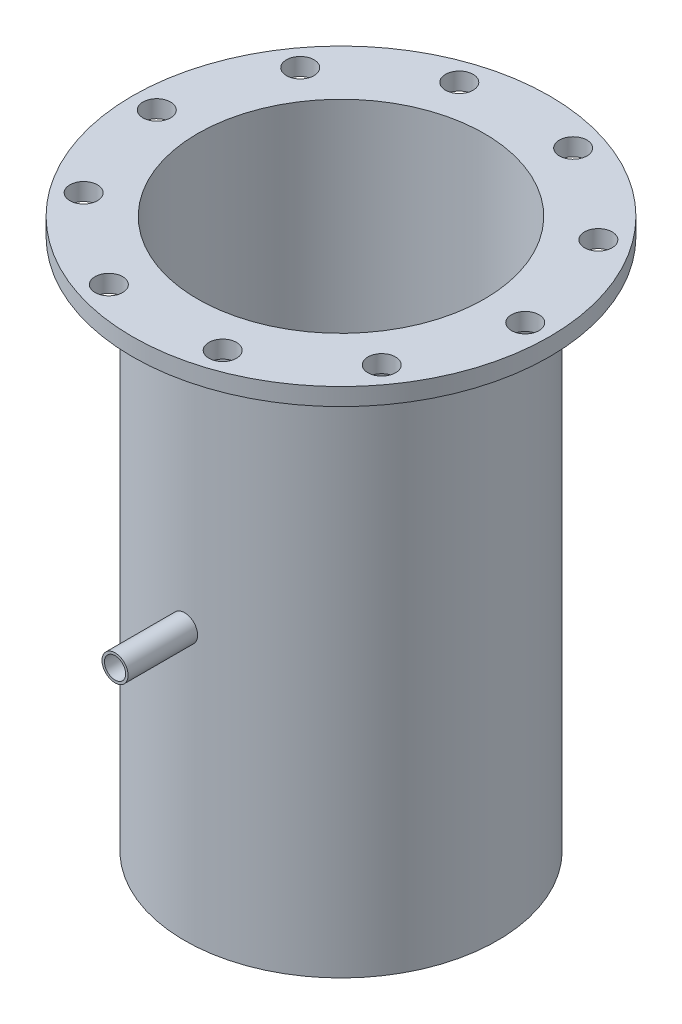
ISO-10303-21;
HEADER;
FILE_DESCRIPTION(('STEP AP214'),'2;1');
FILE_NAME('part.step','',(''),(''),'','','');
FILE_SCHEMA(('AUTOMOTIVE_DESIGN { 1 0 10303 214 1 1 1 1 }'));
ENDSEC;
DATA;
#1=APPLICATION_CONTEXT('core data for automotive mechanical design processes');
#2=APPLICATION_PROTOCOL_DEFINITION('international standard','automotive_design',2000,#1);
#3=PRODUCT_CONTEXT('',#1,'mechanical');
#4=PRODUCT('Part','Part','',(#3));
#5=PRODUCT_RELATED_PRODUCT_CATEGORY('part','',(#4));
#6=PRODUCT_DEFINITION_FORMATION('','',#4);
#7=PRODUCT_DEFINITION_CONTEXT('part definition',#1,'design');
#8=PRODUCT_DEFINITION('design','',#6,#7);
#9=PRODUCT_DEFINITION_SHAPE('','',#8);
#10=(LENGTH_UNIT() NAMED_UNIT(*) SI_UNIT(.MILLI.,.METRE.));
#11=(NAMED_UNIT(*) PLANE_ANGLE_UNIT() SI_UNIT($,.RADIAN.));
#12=(NAMED_UNIT(*) SI_UNIT($,.STERADIAN.) SOLID_ANGLE_UNIT());
#13=UNCERTAINTY_MEASURE_WITH_UNIT(LENGTH_MEASURE(1.E-05),#10,'distance_accuracy_value','');
#14=(GEOMETRIC_REPRESENTATION_CONTEXT(3) GLOBAL_UNCERTAINTY_ASSIGNED_CONTEXT((#13)) GLOBAL_UNIT_ASSIGNED_CONTEXT((#10,
#11,#12)) REPRESENTATION_CONTEXT('',''));
#15=CARTESIAN_POINT('',(0.,0.,0.));
#16=DIRECTION('',(0.,0.,1.));
#17=DIRECTION('',(1.,0.,0.));
#18=AXIS2_PLACEMENT_3D('',#15,#16,#17);
#19=CARTESIAN_POINT('',(0.,-101.6,82.5499999999989));
#20=DIRECTION('',(0.,0.,1.));
#21=DIRECTION('',(1.,0.,0.));
#22=AXIS2_PLACEMENT_3D('',#19,#20,#21);
#23=PLANE('',#22);
#24=CARTESIAN_POINT('',(0.,-101.6,82.5499999999989));
#25=DIRECTION('',(0.,0.,1.));
#26=DIRECTION('',(1.,0.,0.));
#27=AXIS2_PLACEMENT_3D('',#24,#25,#26);
#28=CIRCLE('',#27,4.76249999999999);
#29=CARTESIAN_POINT('',(4.76249999999999,-101.6,82.5499999999989));
#30=VERTEX_POINT('',#29);
#31=EDGE_CURVE('E11',#30,#30,#28,.T.);
#32=ORIENTED_EDGE('',*,*,#31,.T.);
#33=EDGE_LOOP('',(#32));
#34=FACE_BOUND('',#33,.T.);
#35=CARTESIAN_POINT('',(0.,-101.6,82.5499999999989));
#36=DIRECTION('',(0.,0.,1.));
#37=DIRECTION('',(1.,0.,0.));
#38=AXIS2_PLACEMENT_3D('',#35,#36,#37);
#39=CIRCLE('',#38,3.8735);
#40=CARTESIAN_POINT('',(3.8735,-101.6,82.5499999999989));
#41=VERTEX_POINT('',#40);
#42=EDGE_CURVE('E62',#41,#41,#39,.T.);
#43=ORIENTED_EDGE('',*,*,#42,.F.);
#44=EDGE_LOOP('',(#43));
#45=FACE_BOUND('',#44,.T.);
#46=ADVANCED_FACE('F47',(#34,#45),#23,.T.);
#47=CARTESIAN_POINT('',(0.,-101.6,57.1499999999989));
#48=DIRECTION('',(0.,0.,1.));
#49=DIRECTION('',(1.,0.,0.));
#50=AXIS2_PLACEMENT_3D('',#47,#48,#49);
#51=PLANE('',#50);
#52=CARTESIAN_POINT('',(0.,-101.6,57.1499999999989));
#53=DIRECTION('',(0.,0.,1.));
#54=DIRECTION('',(1.,0.,0.));
#55=AXIS2_PLACEMENT_3D('',#52,#53,#54);
#56=CIRCLE('',#55,4.76249999999999);
#57=CARTESIAN_POINT('',(4.76249999999999,-101.6,57.1499999999989));
#58=VERTEX_POINT('',#57);
#59=EDGE_CURVE('E51',#58,#58,#56,.T.);
#60=ORIENTED_EDGE('',*,*,#59,.F.);
#61=EDGE_LOOP('',(#60));
#62=FACE_BOUND('',#61,.T.);
#63=CARTESIAN_POINT('',(0.,-101.6,57.1499999999989));
#64=DIRECTION('',(0.,0.,1.));
#65=DIRECTION('',(1.,0.,0.));
#66=AXIS2_PLACEMENT_3D('',#63,#64,#65);
#67=CIRCLE('',#66,3.8735);
#68=CARTESIAN_POINT('',(3.8735,-101.6,57.1499999999989));
#69=VERTEX_POINT('',#68);
#70=EDGE_CURVE('E64',#69,#69,#67,.T.);
#71=ORIENTED_EDGE('',*,*,#70,.T.);
#72=EDGE_LOOP('',(#71));
#73=FACE_BOUND('',#72,.T.);
#74=ADVANCED_FACE('F74',(#62,#73),#51,.F.);
#75=CARTESIAN_POINT('',(0.,-101.6,82.5499999999989));
#76=DIRECTION('',(0.,0.,-1.));
#77=DIRECTION('',(-1.,0.,0.));
#78=AXIS2_PLACEMENT_3D('',#75,#76,#77);
#79=CYLINDRICAL_SURFACE('',#78,4.76249999999999);
#80=ORIENTED_EDGE('',*,*,#31,.F.);
#81=EDGE_LOOP('',(#80));
#82=FACE_BOUND('',#81,.T.);
#83=ORIENTED_EDGE('',*,*,#59,.T.);
#84=EDGE_LOOP('',(#83));
#85=FACE_BOUND('',#84,.T.);
#86=ADVANCED_FACE('F49',(#82,#85),#79,.T.);
#87=CARTESIAN_POINT('',(0.,-101.6,82.5499999999989));
#88=DIRECTION('',(0.,0.,-1.));
#89=DIRECTION('',(-1.,0.,0.));
#90=AXIS2_PLACEMENT_3D('',#87,#88,#89);
#91=CYLINDRICAL_SURFACE('',#90,3.8735);
#92=ORIENTED_EDGE('',*,*,#42,.T.);
#93=EDGE_LOOP('',(#92));
#94=FACE_BOUND('',#93,.T.);
#95=ORIENTED_EDGE('',*,*,#70,.F.);
#96=EDGE_LOOP('',(#95));
#97=FACE_BOUND('',#96,.T.);
#98=ADVANCED_FACE('F70',(#94,#97),#91,.F.);
#99=CLOSED_SHELL('',(#46,#74,#86,#98));
#100=MANIFOLD_SOLID_BREP('B2',#99);
#101=CARTESIAN_POINT('',(76.2,1.20932865269393E-13,0.));
#102=DIRECTION('',(0.,-1.,0.));
#103=DIRECTION('',(1.,0.,0.));
#104=AXIS2_PLACEMENT_3D('',#101,#102,#103);
#105=PLANE('',#104);
#106=CARTESIAN_POINT('',(-20.799933891378,-2.16733220838477E-13,-64.0156141118267));
#107=DIRECTION('',(0.,1.,0.));
#108=DIRECTION('',(0.,0.,1.));
#109=AXIS2_PLACEMENT_3D('',#106,#107,#108);
#110=CIRCLE('',#109,5.04189999999997);
#111=CARTESIAN_POINT('',(-20.799933891378,-2.16733220838477E-13,-58.9737141118267));
#112=VERTEX_POINT('',#111);
#113=EDGE_CURVE('E159',#112,#112,#110,.T.);
#114=ORIENTED_EDGE('',*,*,#113,.F.);
#115=EDGE_LOOP('',(#114));
#116=FACE_BOUND('',#115,.T.);
#117=CARTESIAN_POINT('',(20.7999338913775,2.16470374895971E-13,-64.0156141118268));
#118=DIRECTION('',(0.,1.,0.));
#119=DIRECTION('',(0.,0.,1.));
#120=AXIS2_PLACEMENT_3D('',#117,#118,#119);
#121=CIRCLE('',#120,5.04189999999997);
#122=CARTESIAN_POINT('',(20.7999338913775,2.16470374895971E-13,-58.9737141118269));
#123=VERTEX_POINT('',#122);
#124=EDGE_CURVE('E155',#123,#123,#121,.T.);
#125=ORIENTED_EDGE('',*,*,#124,.F.);
#126=EDGE_LOOP('',(#125));
#127=FACE_BOUND('',#126,.T.);
#128=CARTESIAN_POINT('',(54.4549338913777,5.66939445869475E-13,-39.5638253318064));
#129=DIRECTION('',(0.,1.,0.));
#130=DIRECTION('',(0.,0.,1.));
#131=AXIS2_PLACEMENT_3D('',#128,#129,#130);
#132=CIRCLE('',#131,5.04189999999997);
#133=CARTESIAN_POINT('',(54.4549338913777,5.66939445869475E-13,-34.5219253318065));
#134=VERTEX_POINT('',#133);
#135=EDGE_CURVE('E151',#134,#134,#132,.T.);
#136=ORIENTED_EDGE('',*,*,#135,.F.);
#137=EDGE_LOOP('',(#136));
#138=FACE_BOUND('',#137,.T.);
#139=CARTESIAN_POINT('',(67.31,7.00806718975755E-13,0.));
#140=DIRECTION('',(0.,1.,0.));
#141=DIRECTION('',(0.,0.,1.));
#142=AXIS2_PLACEMENT_3D('',#139,#140,#141);
#143=CIRCLE('',#142,5.04189999999997);
#144=CARTESIAN_POINT('',(67.31,7.00806718975755E-13,5.04189999999997));
#145=VERTEX_POINT('',#144);
#146=EDGE_CURVE('E150',#145,#145,#143,.T.);
#147=ORIENTED_EDGE('',*,*,#146,.F.);
#148=EDGE_LOOP('',(#147));
#149=FACE_BOUND('',#148,.T.);
#150=CARTESIAN_POINT('',(0.,-5.4845766859262E-13,0.));
#151=DIRECTION('',(0.,1.,0.));
#152=DIRECTION('',(-1.,0.,0.));
#153=AXIS2_PLACEMENT_3D('',#150,#151,#152);
#154=CIRCLE('',#153,52.3875);
#155=CARTESIAN_POINT('',(-52.3875,-1.09399914699477E-12,0.));
#156=VERTEX_POINT('',#155);
#157=EDGE_CURVE('E128',#156,#156,#154,.T.);
#158=ORIENTED_EDGE('',*,*,#157,.F.);
#159=EDGE_LOOP('',(#158));
#160=FACE_BOUND('',#159,.T.);
#161=CARTESIAN_POINT('',(0.,-7.96706356220305E-13,0.));
#162=DIRECTION('',(0.,1.,0.));
#163=DIRECTION('',(-1.,0.,0.));
#164=AXIS2_PLACEMENT_3D('',#161,#162,#163);
#165=CIRCLE('',#164,76.2);
#166=CARTESIAN_POINT('',(-76.2,-1.59022123389616E-12,0.));
#167=VERTEX_POINT('',#166);
#168=EDGE_CURVE('E216',#167,#167,#165,.T.);
#169=ORIENTED_EDGE('',*,*,#168,.T.);
#170=EDGE_LOOP('',(#169));
#171=FACE_BOUND('',#170,.T.);
#172=CARTESIAN_POINT('',(-54.4549338913779,-5.67202291811979E-13,-39.5638253318061));
#173=DIRECTION('',(0.,1.,0.));
#174=DIRECTION('',(0.,0.,1.));
#175=AXIS2_PLACEMENT_3D('',#172,#173,#174);
#176=CIRCLE('',#175,5.04189999999997);
#177=CARTESIAN_POINT('',(-54.4549338913779,-5.67202291811979E-13,-34.5219253318061));
#178=VERTEX_POINT('',#177);
#179=EDGE_CURVE('E160',#178,#178,#176,.T.);
#180=ORIENTED_EDGE('',*,*,#179,.F.);
#181=EDGE_LOOP('',(#180));
#182=FACE_BOUND('',#181,.T.);
#183=CARTESIAN_POINT('',(-67.31,-7.01069564918256E-13,0.));
#184=DIRECTION('',(0.,1.,0.));
#185=DIRECTION('',(0.,0.,1.));
#186=AXIS2_PLACEMENT_3D('',#183,#184,#185);
#187=CIRCLE('',#186,5.04189999999997);
#188=CARTESIAN_POINT('',(-67.31,-7.01069564918256E-13,5.04189999999997));
#189=VERTEX_POINT('',#188);
#190=EDGE_CURVE('E164',#189,#189,#187,.T.);
#191=ORIENTED_EDGE('',*,*,#190,.F.);
#192=EDGE_LOOP('',(#191));
#193=FACE_BOUND('',#192,.T.);
#194=CARTESIAN_POINT('',(-54.4549338913774,-5.67202291811973E-13,39.5638253318068));
#195=DIRECTION('',(0.,1.,0.));
#196=DIRECTION('',(0.,0.,1.));
#197=AXIS2_PLACEMENT_3D('',#194,#195,#196);
#198=CIRCLE('',#197,5.04189999999997);
#199=CARTESIAN_POINT('',(-54.4549338913774,-5.67202291811973E-13,44.6057253318068));
#200=VERTEX_POINT('',#199);
#201=EDGE_CURVE('E168',#200,#200,#198,.T.);
#202=ORIENTED_EDGE('',*,*,#201,.F.);
#203=EDGE_LOOP('',(#202));
#204=FACE_BOUND('',#203,.T.);
#205=CARTESIAN_POINT('',(-20.7999338913771,-2.16733220838468E-13,64.015614111827));
#206=DIRECTION('',(0.,1.,0.));
#207=DIRECTION('',(0.,0.,1.));
#208=AXIS2_PLACEMENT_3D('',#205,#206,#207);
#209=CIRCLE('',#208,5.04189999999997);
#210=CARTESIAN_POINT('',(-20.7999338913771,-2.16733220838468E-13,69.0575141118269));
#211=VERTEX_POINT('',#210);
#212=EDGE_CURVE('E172',#211,#211,#209,.T.);
#213=ORIENTED_EDGE('',*,*,#212,.F.);
#214=EDGE_LOOP('',(#213));
#215=FACE_BOUND('',#214,.T.);
#216=CARTESIAN_POINT('',(20.7999338913784,2.16470374895981E-13,64.0156141118266));
#217=DIRECTION('',(0.,1.,0.));
#218=DIRECTION('',(0.,0.,1.));
#219=AXIS2_PLACEMENT_3D('',#216,#217,#218);
#220=CIRCLE('',#219,5.04189999999997);
#221=CARTESIAN_POINT('',(20.7999338913784,2.16470374895981E-13,69.0575141118265));
#222=VERTEX_POINT('',#221);
#223=EDGE_CURVE('E175',#222,#222,#220,.T.);
#224=ORIENTED_EDGE('',*,*,#223,.F.);
#225=EDGE_LOOP('',(#224));
#226=FACE_BOUND('',#225,.T.);
#227=CARTESIAN_POINT('',(54.4549338913782,5.66939445869481E-13,39.5638253318057));
#228=DIRECTION('',(0.,1.,0.));
#229=DIRECTION('',(0.,0.,1.));
#230=AXIS2_PLACEMENT_3D('',#227,#228,#229);
#231=CIRCLE('',#230,5.04189999999997);
#232=CARTESIAN_POINT('',(54.4549338913782,5.66939445869481E-13,44.6057253318056));
#233=VERTEX_POINT('',#232);
#234=EDGE_CURVE('E178',#233,#233,#231,.T.);
#235=ORIENTED_EDGE('',*,*,#234,.F.);
#236=EDGE_LOOP('',(#235));
#237=FACE_BOUND('',#236,.T.);
#238=ADVANCED_FACE('F116',(#116,#127,#138,#149,#160,#171,#182,#193,#204,#215,#226,#237),#105,.F.);
#239=CARTESIAN_POINT('',(0.,0.,0.));
#240=DIRECTION('',(0.,1.,0.));
#241=DIRECTION('',(-1.,0.,0.));
#242=AXIS2_PLACEMENT_3D('',#239,#240,#241);
#243=CYLINDRICAL_SURFACE('',#242,52.3874999999991);
#244=CARTESIAN_POINT('',(1.58749999999999,-101.6,52.3634414453434));
#245=CARTESIAN_POINT('',(1.58749605334298,-101.510851394726,52.3634417699457));
#246=CARTESIAN_POINT('',(1.57996536949235,-101.421638669327,52.3636715537569));
#247=CARTESIAN_POINT('',(1.55002932361462,-101.245671690355,52.364566081924));
#248=CARTESIAN_POINT('',(1.52760619641222,-101.158920502179,52.3652313457498));
#249=CARTESIAN_POINT('',(1.46852553715922,-100.990451285521,52.3669214042028));
#250=CARTESIAN_POINT('',(1.43187497204651,-100.908730816237,52.3679460228363));
#251=CARTESIAN_POINT('',(1.34538981100749,-100.752625194846,52.3702391119555));
#252=CARTESIAN_POINT('',(1.29555843223709,-100.678238258852,52.3715075229161));
#253=CARTESIAN_POINT('',(1.18409917405513,-100.538853988268,52.3741459580202));
#254=CARTESIAN_POINT('',(1.12246668376462,-100.473860341258,52.3755160217525));
#255=CARTESIAN_POINT('',(0.989162788903489,-100.355138610623,52.3782029861036));
#256=CARTESIAN_POINT('',(0.917490984631366,-100.301410975752,52.379519884603));
#257=CARTESIAN_POINT('',(0.766129167202388,-100.206740554413,52.381952270866));
#258=CARTESIAN_POINT('',(0.68643776283704,-100.165799991269,52.3830677235895));
#259=CARTESIAN_POINT('',(0.52130880816257,-100.097880336038,52.3849711681521));
#260=CARTESIAN_POINT('',(0.43587128112312,-100.070901187416,52.3857591613172));
#261=CARTESIAN_POINT('',(0.261703301046753,-100.03167815935,52.3869186449946));
#262=CARTESIAN_POINT('',(0.17297387471299,-100.019429724747,52.3872902642593));
#263=CARTESIAN_POINT('',(-0.00528244311589997,-100.010001779893,52.38757554135));
#264=CARTESIAN_POINT('',(-0.0948093313930118,-100.012822208863,52.3874892010232));
#265=CARTESIAN_POINT('',(-0.272088371299302,-100.033448082269,52.3868684017544));
#266=CARTESIAN_POINT('',(-0.359841095748341,-100.051248608366,52.3863340898929));
#267=CARTESIAN_POINT('',(-0.531112178997399,-100.101321776004,52.3848777350298));
#268=CARTESIAN_POINT('',(-0.614630528396328,-100.133594449675,52.3839556911674));
#269=CARTESIAN_POINT('',(-0.775077889717085,-100.211701447821,52.3818275374945));
#270=CARTESIAN_POINT('',(-0.852005803938502,-100.257538025855,52.3806213804872));
#271=CARTESIAN_POINT('',(-0.997076546010364,-100.361470020824,52.3780609301778));
#272=CARTESIAN_POINT('',(-1.06521935330345,-100.419565466446,52.376706636529));
#273=CARTESIAN_POINT('',(-1.19081423128111,-100.54639391922,52.3740018931666));
#274=CARTESIAN_POINT('',(-1.24826199211306,-100.615131194431,52.3726514452175));
#275=CARTESIAN_POINT('',(-1.35080285896167,-100.761277047552,52.370107191872));
#276=CARTESIAN_POINT('',(-1.39589596293355,-100.838685626897,52.3689133865014));
#277=CARTESIAN_POINT('',(-1.47244701258908,-100.999979155469,52.3668170667423));
#278=CARTESIAN_POINT('',(-1.5039048183634,-101.083864171138,52.3659145553427));
#279=CARTESIAN_POINT('',(-1.55228952000247,-101.255728270701,52.3645027128852));
#280=CARTESIAN_POINT('',(-1.56921645628012,-101.343707343206,52.3639933807339));
#281=CARTESIAN_POINT('',(-1.58805363474005,-101.521224643402,52.3634255245861));
#282=CARTESIAN_POINT('',(-1.58996984768335,-101.61076223696,52.3633668213449));
#283=CARTESIAN_POINT('',(-1.57874674469409,-101.788887849922,52.3637063745061));
#284=CARTESIAN_POINT('',(-1.56560744657682,-101.87747587045,52.3641046303678));
#285=CARTESIAN_POINT('',(-1.52465124490689,-102.051170971284,52.365313043087));
#286=CARTESIAN_POINT('',(-1.49683705488895,-102.136278691998,52.3661231237929));
#287=CARTESIAN_POINT('',(-1.42732336831548,-102.300616946027,52.3680638011517));
#288=CARTESIAN_POINT('',(-1.38562384322144,-102.379847467261,52.3691943984634));
#289=CARTESIAN_POINT('',(-1.28950780192126,-102.530209748727,52.3716490947768));
#290=CARTESIAN_POINT('',(-1.23508726464016,-102.601338937556,52.3729732549136));
#291=CARTESIAN_POINT('',(-1.11507990501404,-102.733453622549,52.3756655872251));
#292=CARTESIAN_POINT('',(-1.04949305367858,-102.794439092377,52.3770337595141));
#293=CARTESIAN_POINT('',(-0.908989270588625,-102.904555102564,52.3796604035778));
#294=CARTESIAN_POINT('',(-0.834069320192632,-102.95368179222,52.3809188396352));
#295=CARTESIAN_POINT('',(-0.677041457006942,-103.038659379455,52.3831836440945));
#296=CARTESIAN_POINT('',(-0.594933560582706,-103.074510307259,52.3841900130703));
#297=CARTESIAN_POINT('',(-0.425875064900393,-103.131911943588,52.3858370688773));
#298=CARTESIAN_POINT('',(-0.338925313296399,-103.153465146709,52.3864778194971));
#299=CARTESIAN_POINT('',(-0.162639278082235,-103.181667699069,52.3873216628192));
#300=CARTESIAN_POINT('',(-0.0733029966915635,-103.188317062169,52.3875247559286));
#301=CARTESIAN_POINT('',(0.105181658087533,-103.186522894775,52.3874703944013));
#302=CARTESIAN_POINT('',(0.194330092583723,-103.17808543131,52.3872131248953));
#303=CARTESIAN_POINT('',(0.369944465273422,-103.146369596908,52.3862673900868));
#304=CARTESIAN_POINT('',(0.456410398158961,-103.123091196608,52.3855789239311));
#305=CARTESIAN_POINT('',(0.624207615801009,-103.06235511976,52.3838483423651));
#306=CARTESIAN_POINT('',(0.705538815116161,-103.024897207339,52.3828062210719));
#307=CARTESIAN_POINT('',(0.86075645979019,-102.936867466166,52.3804857476095));
#308=CARTESIAN_POINT('',(0.93464317378748,-102.886296110855,52.3792074039693));
#309=CARTESIAN_POINT('',(1.07290241213022,-102.77345707217,52.3765580016925));
#310=CARTESIAN_POINT('',(1.1372721181388,-102.711185936408,52.375186915766));
#311=CARTESIAN_POINT('',(1.25466134648337,-102.576702782052,52.3725065161489));
#312=CARTESIAN_POINT('',(1.30767805458305,-102.504488305926,52.3711972178371));
#313=CARTESIAN_POINT('',(1.40086553675492,-102.352139782043,52.3687875855987));
#314=CARTESIAN_POINT('',(1.44102791298361,-102.27200060157,52.3676873884695));
#315=CARTESIAN_POINT('',(1.5072811800323,-102.106175329262,52.3658225237447));
#316=CARTESIAN_POINT('',(1.53338884893491,-102.020495988644,52.3650574562857));
#317=CARTESIAN_POINT('',(1.56387364214342,-101.878562941283,52.3641536118903));
#318=CARTESIAN_POINT('',(1.57272237629605,-101.823230472512,52.3638877098981));
#319=CARTESIAN_POINT('',(1.58453679353414,-101.711940430943,52.3635315247305));
#320=CARTESIAN_POINT('',(1.58750247839143,-101.655982858334,52.3634412415022));
#321=CARTESIAN_POINT('',(1.58749999999999,-101.6,52.3634414453434));
#322=B_SPLINE_CURVE_WITH_KNOTS('',3,(#244,#245,#246,#247,#248,#249,#250,#251,#252,#253,#254,
#255,#256,#257,#258,#259,#260,#261,#262,#263,#264,#265,#266,#267,#268,#269,#270,#271,#272,#273,
#274,#275,#276,#277,#278,#279,#280,#281,#282,#283,#284,#285,#286,#287,#288,#289,#290,#291,#292,
#293,#294,#295,#296,#297,#298,#299,#300,#301,#302,#303,#304,#305,#306,#307,#308,#309,#310,#311,
#312,#313,#314,#315,#316,#317,#318,#319,#320,#321),.UNSPECIFIED.,.T.,.F.,(4,2,2,2,2,2,2,2,2,2,2,
2,2,2,2,2,2,2,2,2,2,2,2,2,2,2,2,2,2,2,2,2,2,2,2,2,2,2,4),(0.,0.26724147085534,0.534802307659918,
0.802232289347037,1.06959705720717,1.33706650261993,1.60454659998991,1.87207317900069,
2.13959867469298,2.40704142253985,2.67448309165799,2.94183698724582,3.20919147638232,
3.47659040975562,3.74398996883748,4.01149705151728,4.27900417847161,4.54651405020324,
4.81402317794075,5.0814258941362,5.34882829391245,5.61618126562285,5.88353478682684,
6.15097293225497,6.41841177202756,6.68593733629001,6.95346229146817,7.22094055792727,
7.4884185756374,7.75578905370639,8.02316006079795,8.29053551573941,8.55790131883006,
8.82534614088055,9.09285718190709,9.360542635097,9.62790782089107,9.79572812344937,
9.96354837546444),.UNSPECIFIED.);
#323=CARTESIAN_POINT('',(1.58749999999999,-101.6,52.3634414453434));
#324=VERTEX_POINT('',#323);
#325=EDGE_CURVE('E184',#324,#324,#322,.T.);
#326=ORIENTED_EDGE('',*,*,#325,.T.);
#327=EDGE_LOOP('',(#326));
#328=FACE_BOUND('',#327,.T.);
#329=CARTESIAN_POINT('',(1.77869966591641E-12,-170.805763516126,0.));
#330=DIRECTION('',(0.,1.,0.));
#331=DIRECTION('',(-1.,0.,0.));
#332=AXIS2_PLACEMENT_3D('',#329,#330,#331);
#333=CIRCLE('',#332,52.3874999999982);
#334=CARTESIAN_POINT('',(-52.3874999999965,-170.805763516127,0.));
#335=VERTEX_POINT('',#334);
#336=EDGE_CURVE('E135',#335,#335,#333,.T.);
#337=ORIENTED_EDGE('',*,*,#336,.F.);
#338=EDGE_LOOP('',(#337));
#339=FACE_BOUND('',#338,.T.);
#340=ORIENTED_EDGE('',*,*,#157,.T.);
#341=EDGE_LOOP('',(#340));
#342=FACE_BOUND('',#341,.T.);
#343=ADVANCED_FACE('F283',(#328,#339,#342),#243,.F.);
#344=CARTESIAN_POINT('',(54.9275,-170.805763516126,0.));
#345=DIRECTION('',(0.,1.,0.));
#346=DIRECTION('',(-1.,0.,0.));
#347=AXIS2_PLACEMENT_3D('',#344,#345,#346);
#348=PLANE('',#347);
#349=CARTESIAN_POINT('',(1.77869966591641E-12,-170.805763516126,0.));
#350=DIRECTION('',(0.,1.,0.));
#351=DIRECTION('',(-1.,0.,0.));
#352=AXIS2_PLACEMENT_3D('',#349,#350,#351);
#353=CIRCLE('',#352,54.9274999999982);
#354=CARTESIAN_POINT('',(-54.9274999999965,-170.805763516127,0.));
#355=VERTEX_POINT('',#354);
#356=EDGE_CURVE('E142',#355,#355,#353,.T.);
#357=ORIENTED_EDGE('',*,*,#356,.F.);
#358=EDGE_LOOP('',(#357));
#359=FACE_BOUND('',#358,.T.);
#360=ORIENTED_EDGE('',*,*,#336,.T.);
#361=EDGE_LOOP('',(#360));
#362=FACE_BOUND('',#361,.T.);
#363=ADVANCED_FACE('F280',(#359,#362),#348,.F.);
#364=CARTESIAN_POINT('',(0.,0.,0.));
#365=DIRECTION('',(0.,1.,0.));
#366=DIRECTION('',(-1.,0.,0.));
#367=AXIS2_PLACEMENT_3D('',#364,#365,#366);
#368=CYLINDRICAL_SURFACE('',#367,54.9274999999982);
#369=CARTESIAN_POINT('',(1.82869110320998E-12,-175.606363516126,0.));
#370=DIRECTION('',(0.,1.,0.));
#371=DIRECTION('',(-1.,0.,0.));
#372=AXIS2_PLACEMENT_3D('',#369,#370,#371);
#373=CIRCLE('',#372,54.9274999999982);
#374=CARTESIAN_POINT('',(-54.9274999999964,-175.606363516127,0.));
#375=VERTEX_POINT('',#374);
#376=EDGE_CURVE('E271',#375,#375,#373,.T.);
#377=ORIENTED_EDGE('',*,*,#376,.F.);
#378=EDGE_LOOP('',(#377));
#379=FACE_BOUND('',#378,.T.);
#380=ORIENTED_EDGE('',*,*,#356,.T.);
#381=EDGE_LOOP('',(#380));
#382=FACE_BOUND('',#381,.T.);
#383=ADVANCED_FACE('F278',(#379,#382),#368,.F.);
#384=CARTESIAN_POINT('',(52.3875,-175.606363516126,0.));
#385=DIRECTION('',(0.,-1.,0.));
#386=DIRECTION('',(1.,0.,0.));
#387=AXIS2_PLACEMENT_3D('',#384,#385,#386);
#388=PLANE('',#387);
#389=CARTESIAN_POINT('',(1.82869110320998E-12,-175.606363516126,0.));
#390=DIRECTION('',(0.,1.,0.));
#391=DIRECTION('',(-1.,0.,0.));
#392=AXIS2_PLACEMENT_3D('',#389,#390,#391);
#393=CIRCLE('',#392,52.3874999999982);
#394=CARTESIAN_POINT('',(-52.3874999999964,-175.606363516127,0.));
#395=VERTEX_POINT('',#394);
#396=EDGE_CURVE('E267',#395,#395,#393,.T.);
#397=ORIENTED_EDGE('',*,*,#396,.F.);
#398=EDGE_LOOP('',(#397));
#399=FACE_BOUND('',#398,.T.);
#400=ORIENTED_EDGE('',*,*,#376,.T.);
#401=EDGE_LOOP('',(#400));
#402=FACE_BOUND('',#401,.T.);
#403=ADVANCED_FACE('F297',(#399,#402),#388,.F.);
#404=CARTESIAN_POINT('',(0.,0.,0.));
#405=DIRECTION('',(0.,1.,0.));
#406=DIRECTION('',(-1.,0.,0.));
#407=AXIS2_PLACEMENT_3D('',#404,#405,#406);
#408=CYLINDRICAL_SURFACE('',#407,52.3874999999982);
#409=CARTESIAN_POINT('',(1.86836684709378E-12,-179.416363516126,0.));
#410=DIRECTION('',(0.,1.,0.));
#411=DIRECTION('',(-1.,0.,0.));
#412=AXIS2_PLACEMENT_3D('',#409,#410,#411);
#413=CIRCLE('',#412,52.3874999999981);
#414=CARTESIAN_POINT('',(-52.3874999999963,-179.416363516127,0.));
#415=VERTEX_POINT('',#414);
#416=EDGE_CURVE('E263',#415,#415,#413,.T.);
#417=ORIENTED_EDGE('',*,*,#416,.F.);
#418=EDGE_LOOP('',(#417));
#419=FACE_BOUND('',#418,.T.);
#420=ORIENTED_EDGE('',*,*,#396,.T.);
#421=EDGE_LOOP('',(#420));
#422=FACE_BOUND('',#421,.T.);
#423=ADVANCED_FACE('F301',(#419,#422),#408,.F.);
#424=CARTESIAN_POINT('',(54.9275,-179.416363516126,0.));
#425=DIRECTION('',(0.,1.,0.));
#426=DIRECTION('',(-1.,0.,0.));
#427=AXIS2_PLACEMENT_3D('',#424,#425,#426);
#428=PLANE('',#427);
#429=CARTESIAN_POINT('',(1.86836684709378E-12,-179.416363516126,0.));
#430=DIRECTION('',(0.,1.,0.));
#431=DIRECTION('',(-1.,0.,0.));
#432=AXIS2_PLACEMENT_3D('',#429,#430,#431);
#433=CIRCLE('',#432,54.9274999999982);
#434=CARTESIAN_POINT('',(-54.9274999999963,-179.416363516127,0.));
#435=VERTEX_POINT('',#434);
#436=EDGE_CURVE('E259',#435,#435,#433,.T.);
#437=ORIENTED_EDGE('',*,*,#436,.F.);
#438=EDGE_LOOP('',(#437));
#439=FACE_BOUND('',#438,.T.);
#440=ORIENTED_EDGE('',*,*,#416,.T.);
#441=EDGE_LOOP('',(#440));
#442=FACE_BOUND('',#441,.T.);
#443=ADVANCED_FACE('F305',(#439,#442),#428,.F.);
#444=CARTESIAN_POINT('',(0.,0.,0.));
#445=DIRECTION('',(0.,1.,0.));
#446=DIRECTION('',(-1.,0.,0.));
#447=AXIS2_PLACEMENT_3D('',#444,#445,#446);
#448=CYLINDRICAL_SURFACE('',#447,54.9274999999981);
#449=CARTESIAN_POINT('',(1.91835828438736E-12,-184.216963516126,0.));
#450=DIRECTION('',(0.,1.,0.));
#451=DIRECTION('',(-1.,0.,0.));
#452=AXIS2_PLACEMENT_3D('',#449,#450,#451);
#453=CIRCLE('',#452,54.9274999999981);
#454=CARTESIAN_POINT('',(-54.9274999999962,-184.216963516127,0.));
#455=VERTEX_POINT('',#454);
#456=EDGE_CURVE('E255',#455,#455,#453,.T.);
#457=ORIENTED_EDGE('',*,*,#456,.F.);
#458=EDGE_LOOP('',(#457));
#459=FACE_BOUND('',#458,.T.);
#460=ORIENTED_EDGE('',*,*,#436,.T.);
#461=EDGE_LOOP('',(#460));
#462=FACE_BOUND('',#461,.T.);
#463=ADVANCED_FACE('F309',(#459,#462),#448,.F.);
#464=CARTESIAN_POINT('',(52.3875,-184.216963516126,0.));
#465=DIRECTION('',(0.,-1.,0.));
#466=DIRECTION('',(1.,0.,0.));
#467=AXIS2_PLACEMENT_3D('',#464,#465,#466);
#468=PLANE('',#467);
#469=CARTESIAN_POINT('',(1.91835828438736E-12,-184.216963516126,0.));
#470=DIRECTION('',(0.,1.,0.));
#471=DIRECTION('',(-1.,0.,0.));
#472=AXIS2_PLACEMENT_3D('',#469,#470,#471);
#473=CIRCLE('',#472,52.3874999999981);
#474=CARTESIAN_POINT('',(-52.3874999999962,-184.216963516127,0.));
#475=VERTEX_POINT('',#474);
#476=EDGE_CURVE('E251',#475,#475,#473,.T.);
#477=ORIENTED_EDGE('',*,*,#476,.F.);
#478=EDGE_LOOP('',(#477));
#479=FACE_BOUND('',#478,.T.);
#480=ORIENTED_EDGE('',*,*,#456,.T.);
#481=EDGE_LOOP('',(#480));
#482=FACE_BOUND('',#481,.T.);
#483=ADVANCED_FACE('F313',(#479,#482),#468,.F.);
#484=CARTESIAN_POINT('',(0.,0.,0.));
#485=DIRECTION('',(0.,1.,0.));
#486=DIRECTION('',(-1.,0.,0.));
#487=AXIS2_PLACEMENT_3D('',#484,#485,#486);
#488=CYLINDRICAL_SURFACE('',#487,52.3874999999981);
#489=CARTESIAN_POINT('',(1.95803402827115E-12,-188.026963516126,0.));
#490=DIRECTION('',(0.,1.,0.));
#491=DIRECTION('',(-1.,0.,0.));
#492=AXIS2_PLACEMENT_3D('',#489,#490,#491);
#493=CIRCLE('',#492,52.3874999999981);
#494=CARTESIAN_POINT('',(-52.3874999999961,-188.026963516127,0.));
#495=VERTEX_POINT('',#494);
#496=EDGE_CURVE('E247',#495,#495,#493,.T.);
#497=ORIENTED_EDGE('',*,*,#496,.F.);
#498=EDGE_LOOP('',(#497));
#499=FACE_BOUND('',#498,.T.);
#500=ORIENTED_EDGE('',*,*,#476,.T.);
#501=EDGE_LOOP('',(#500));
#502=FACE_BOUND('',#501,.T.);
#503=ADVANCED_FACE('F317',(#499,#502),#488,.F.);
#504=CARTESIAN_POINT('',(52.3875,-188.026963516126,0.));
#505=DIRECTION('',(0.,1.,0.));
#506=DIRECTION('',(-1.,0.,0.));
#507=AXIS2_PLACEMENT_3D('',#504,#505,#506);
#508=PLANE('',#507);
#509=CARTESIAN_POINT('',(1.95803402827115E-12,-188.026963516126,0.));
#510=DIRECTION('',(0.,1.,0.));
#511=DIRECTION('',(-1.,0.,0.));
#512=AXIS2_PLACEMENT_3D('',#509,#510,#511);
#513=CIRCLE('',#512,53.8479999999981);
#514=CARTESIAN_POINT('',(-53.8479999999961,-188.026963516127,0.));
#515=VERTEX_POINT('',#514);
#516=EDGE_CURVE('E243',#515,#515,#513,.T.);
#517=ORIENTED_EDGE('',*,*,#516,.F.);
#518=EDGE_LOOP('',(#517));
#519=FACE_BOUND('',#518,.T.);
#520=ORIENTED_EDGE('',*,*,#496,.T.);
#521=EDGE_LOOP('',(#520));
#522=FACE_BOUND('',#521,.T.);
#523=ADVANCED_FACE('F321',(#519,#522),#508,.F.);
#524=CARTESIAN_POINT('',(0.,0.,0.));
#525=DIRECTION('',(0.,1.,0.));
#526=DIRECTION('',(-1.,0.,0.));
#527=AXIS2_PLACEMENT_3D('',#524,#525,#526);
#528=CYLINDRICAL_SURFACE('',#527,53.8479999999981);
#529=CARTESIAN_POINT('',(1.98977462337818E-12,-191.074963516126,0.));
#530=DIRECTION('',(0.,1.,0.));
#531=DIRECTION('',(-1.,0.,0.));
#532=AXIS2_PLACEMENT_3D('',#529,#530,#531);
#533=CIRCLE('',#532,53.847999999998);
#534=CARTESIAN_POINT('',(-53.847999999996,-191.074963516127,0.));
#535=VERTEX_POINT('',#534);
#536=EDGE_CURVE('E239',#535,#535,#533,.T.);
#537=ORIENTED_EDGE('',*,*,#536,.F.);
#538=EDGE_LOOP('',(#537));
#539=FACE_BOUND('',#538,.T.);
#540=ORIENTED_EDGE('',*,*,#516,.T.);
#541=EDGE_LOOP('',(#540));
#542=FACE_BOUND('',#541,.T.);
#543=ADVANCED_FACE('F325',(#539,#542),#528,.F.);
#544=CARTESIAN_POINT('',(53.848,-191.074963516126,0.));
#545=DIRECTION('',(0.,-1.,0.));
#546=DIRECTION('',(1.,0.,0.));
#547=AXIS2_PLACEMENT_3D('',#544,#545,#546);
#548=PLANE('',#547);
#549=CARTESIAN_POINT('',(1.98977462337818E-12,-191.074963516126,0.));
#550=DIRECTION('',(0.,1.,0.));
#551=DIRECTION('',(-1.,0.,0.));
#552=AXIS2_PLACEMENT_3D('',#549,#550,#551);
#553=CIRCLE('',#552,52.387499999998);
#554=CARTESIAN_POINT('',(-52.387499999996,-191.074963516127,0.));
#555=VERTEX_POINT('',#554);
#556=EDGE_CURVE('E235',#555,#555,#553,.T.);
#557=ORIENTED_EDGE('',*,*,#556,.F.);
#558=EDGE_LOOP('',(#557));
#559=FACE_BOUND('',#558,.T.);
#560=ORIENTED_EDGE('',*,*,#536,.T.);
#561=EDGE_LOOP('',(#560));
#562=FACE_BOUND('',#561,.T.);
#563=ADVANCED_FACE('F329',(#559,#562),#548,.F.);
#564=CARTESIAN_POINT('',(0.,0.,0.));
#565=DIRECTION('',(0.,1.,0.));
#566=DIRECTION('',(-1.,0.,0.));
#567=AXIS2_PLACEMENT_3D('',#564,#565,#566);
#568=CYLINDRICAL_SURFACE('',#567,52.387499999998);
#569=CARTESIAN_POINT('',(2.08896398308766E-12,-200.599963516126,0.));
#570=DIRECTION('',(0.,1.,0.));
#571=DIRECTION('',(-1.,0.,0.));
#572=AXIS2_PLACEMENT_3D('',#569,#570,#571);
#573=CIRCLE('',#572,52.3874999999979);
#574=CARTESIAN_POINT('',(-52.3874999999958,-200.599963516127,0.));
#575=VERTEX_POINT('',#574);
#576=EDGE_CURVE('E232',#575,#575,#573,.T.);
#577=ORIENTED_EDGE('',*,*,#576,.F.);
#578=EDGE_LOOP('',(#577));
#579=FACE_BOUND('',#578,.T.);
#580=ORIENTED_EDGE('',*,*,#556,.T.);
#581=EDGE_LOOP('',(#580));
#582=FACE_BOUND('',#581,.T.);
#583=ADVANCED_FACE('F333',(#579,#582),#568,.F.);
#584=CARTESIAN_POINT('',(52.3875,-200.599963516126,0.));
#585=DIRECTION('',(0.,1.,0.));
#586=DIRECTION('',(-1.,0.,0.));
#587=AXIS2_PLACEMENT_3D('',#584,#585,#586);
#588=PLANE('',#587);
#589=CARTESIAN_POINT('',(2.08896398308766E-12,-200.599963516126,0.));
#590=DIRECTION('',(0.,1.,0.));
#591=DIRECTION('',(-1.,0.,0.));
#592=AXIS2_PLACEMENT_3D('',#589,#590,#591);
#593=CIRCLE('',#592,57.1499999999979);
#594=CARTESIAN_POINT('',(-57.1499999999958,-200.599963516127,0.));
#595=VERTEX_POINT('',#594);
#596=EDGE_CURVE('E229',#595,#595,#593,.T.);
#597=ORIENTED_EDGE('',*,*,#596,.F.);
#598=EDGE_LOOP('',(#597));
#599=FACE_BOUND('',#598,.T.);
#600=ORIENTED_EDGE('',*,*,#576,.T.);
#601=EDGE_LOOP('',(#600));
#602=FACE_BOUND('',#601,.T.);
#603=ADVANCED_FACE('F337',(#599,#602),#588,.F.);
#604=CARTESIAN_POINT('',(0.,0.,0.));
#605=DIRECTION('',(0.,1.,0.));
#606=DIRECTION('',(-1.,0.,0.));
#607=AXIS2_PLACEMENT_3D('',#604,#605,#606);
#608=CYLINDRICAL_SURFACE('',#607,57.1499999999989);
#609=CARTESIAN_POINT('',(1.58749999999999,-101.6,57.1279471340419));
#610=CARTESIAN_POINT('',(1.58749605211175,-101.689152114199,57.1279474316997));
#611=CARTESIAN_POINT('',(1.57996477777724,-101.778368434292,57.128158067754));
#612=CARTESIAN_POINT('',(1.55002624968093,-101.954342744377,57.1289780604651));
#613=CARTESIAN_POINT('',(1.52760120702016,-102.04109766515,57.1295878939049));
#614=CARTESIAN_POINT('',(1.4685151605687,-102.209574366095,57.131137146312));
#615=CARTESIAN_POINT('',(1.43186109764306,-102.291298577746,57.1320764045656));
#616=CARTESIAN_POINT('',(1.3453673794669,-102.44741094187,57.1341784653257));
#617=CARTESIAN_POINT('',(1.29553095151814,-102.521800883805,57.1353412130985));
#618=CARTESIAN_POINT('',(1.1840628799189,-102.661186617856,57.1377597968267));
#619=CARTESIAN_POINT('',(1.12242716473918,-102.726179153621,57.1390156648227));
#620=CARTESIAN_POINT('',(0.989117012605628,-102.844897856336,57.1414786515467));
#621=CARTESIAN_POINT('',(0.917442176863669,-102.898623575518,57.1426857683356));
#622=CARTESIAN_POINT('',(0.766077323839181,-102.993287844067,57.144915318081));
#623=CARTESIAN_POINT('',(0.686386161691531,-103.034224563514,57.1459377245994));
#624=CARTESIAN_POINT('',(0.521258984462645,-103.102136824492,57.1476823650718));
#625=CARTESIAN_POINT('',(0.435822990773939,-103.129112418008,57.1484046001434));
#626=CARTESIAN_POINT('',(0.261654822905389,-103.168330026972,57.1494673166232));
#627=CARTESIAN_POINT('',(0.172923510266412,-103.180575865855,57.1498078970967));
#628=CARTESIAN_POINT('',(-0.00533600963123361,-103.189998124708,57.1500692438223));
#629=CARTESIAN_POINT('',(-0.0948642139582852,-103.187174600092,57.1499900116181));
#630=CARTESIAN_POINT('',(-0.27215022771742,-103.166541525401,57.1494207497609));
#631=CARTESIAN_POINT('',(-0.359908518480575,-103.148736107521,57.1489308333799));
#632=CARTESIAN_POINT('',(-0.531189911767372,-103.098651066372,57.1475955512312));
#633=CARTESIAN_POINT('',(-0.614713005671812,-103.066371413647,57.1467501847401));
#634=CARTESIAN_POINT('',(-0.775166350965623,-102.988249467337,57.14479908893));
#635=CARTESIAN_POINT('',(-0.852095679673378,-102.942405279616,57.1436933232535));
#636=CARTESIAN_POINT('',(-0.997167613843303,-102.838457031948,57.1413460531883));
#637=CARTESIAN_POINT('',(-1.06531020259512,-102.780352948684,57.1401045485416));
#638=CARTESIAN_POINT('',(-1.19089843189182,-102.653510878535,57.1376252267919));
#639=CARTESIAN_POINT('',(-1.24834045010227,-102.584769305032,57.1363874110769));
#640=CARTESIAN_POINT('',(-1.35086907445976,-102.438616240437,57.1340554420731));
#641=CARTESIAN_POINT('',(-1.39595567864476,-102.361204747968,57.1329612888072));
#642=CARTESIAN_POINT('',(-1.47249321927563,-102.199907268003,57.1310400454698));
#643=CARTESIAN_POINT('',(-1.50394403992341,-102.116021225531,57.1302129576662));
#644=CARTESIAN_POINT('',(-1.55231490904442,-101.944156800725,57.1289191992328));
#645=CARTESIAN_POINT('',(-1.56923499156878,-101.856178427982,57.1284525277583));
#646=CARTESIAN_POINT('',(-1.58805964098903,-101.67865825475,57.1279323730488));
#647=CARTESIAN_POINT('',(-1.58996922508664,-101.589116986684,57.1278787517535));
#648=CARTESIAN_POINT('',(-1.57873174422918,-101.41098512174,57.1281903832332));
#649=CARTESIAN_POINT('',(-1.5655846941333,-101.322394523924,57.1285556355948));
#650=CARTESIAN_POINT('',(-1.52461129875891,-101.148692775065,57.1296637130646));
#651=CARTESIAN_POINT('',(-1.49678723207342,-101.063581086133,57.1304064795635));
#652=CARTESIAN_POINT('',(-1.42725194456905,-100.899236674478,57.1321858020018));
#653=CARTESIAN_POINT('',(-1.38554070004316,-100.820003961792,57.1332223584428));
#654=CARTESIAN_POINT('',(-1.28940216088666,-100.669643533218,57.1354727451845));
#655=CARTESIAN_POINT('',(-1.23497148675063,-100.598517978857,57.1366866225665));
#656=CARTESIAN_POINT('',(-1.11494414380161,-100.466412577475,57.1391546411726));
#657=CARTESIAN_POINT('',(-1.04934744991446,-100.405432753238,57.1404087824872));
#658=CARTESIAN_POINT('',(-0.908828645119023,-100.295333087782,57.1428163486561));
#659=CARTESIAN_POINT('',(-0.833903998447752,-100.246216482243,57.1439697459781));
#660=CARTESIAN_POINT('',(-0.676869101337222,-100.161259634069,57.1460454112666));
#661=CARTESIAN_POINT('',(-0.5947588658622,-100.125419363787,57.1469676797143));
#662=CARTESIAN_POINT('',(-0.425695814193871,-100.06803822904,57.1484769899983));
#663=CARTESIAN_POINT('',(-0.33874371084156,-100.046495265665,57.1490640810384));
#664=CARTESIAN_POINT('',(-0.162455049027922,-100.018313384018,57.1498370501752));
#665=CARTESIAN_POINT('',(-0.0731184917432114,-100.011674458392,57.1500229284699));
#666=CARTESIAN_POINT('',(0.105370719299731,-100.01348935769,57.1499725211979));
#667=CARTESIAN_POINT('',(0.194523425027754,-100.021938079999,57.149736378358));
#668=CARTESIAN_POINT('',(0.370144519721277,-100.053677962774,57.148868819221));
#669=CARTESIAN_POINT('',(0.456612903358319,-100.076969152702,57.1482374021394));
#670=CARTESIAN_POINT('',(0.624412990162669,-100.137732199333,57.1466504232453));
#671=CARTESIAN_POINT('',(0.705744605357144,-100.175204298825,57.1456948558832));
#672=CARTESIAN_POINT('',(0.860960459673797,-100.263263474453,57.1435672610911));
#673=CARTESIAN_POINT('',(0.934844971278735,-100.3138500705,57.1423952415853));
#674=CARTESIAN_POINT('',(1.07309220000807,-100.426716393747,57.1399664259979));
#675=CARTESIAN_POINT('',(1.13745270695402,-100.488998827545,57.1387096103363));
#676=CARTESIAN_POINT('',(1.25482151619644,-100.623502899139,57.136252756959));
#677=CARTESIAN_POINT('',(1.30782700205327,-100.695726995533,57.135052733387));
#678=CARTESIAN_POINT('',(1.40098890785335,-100.848090232612,57.1328444047671));
#679=CARTESIAN_POINT('',(1.44113729057244,-100.928234283417,57.1318362198003));
#680=CARTESIAN_POINT('',(1.50736211798318,-101.094066149741,57.130127492003));
#681=CARTESIAN_POINT('',(1.53345535585072,-101.179747211838,57.1294265822255));
#682=CARTESIAN_POINT('',(1.56390862135458,-101.321641831665,57.1285989448849));
#683=CARTESIAN_POINT('',(1.57274426965151,-101.376934234637,57.1283555764706));
#684=CARTESIAN_POINT('',(1.58454119684748,-101.488142665183,57.1280295776819));
#685=CARTESIAN_POINT('',(1.58750247722705,-101.544058692598,57.127946947267));
#686=CARTESIAN_POINT('',(1.58749999999999,-101.6,57.1279471340419));
#687=B_SPLINE_CURVE_WITH_KNOTS('',3,(#609,#610,#611,#612,#613,#614,#615,#616,#617,#618,#619,
#620,#621,#622,#623,#624,#625,#626,#627,#628,#629,#630,#631,#632,#633,#634,#635,#636,#637,#638,
#639,#640,#641,#642,#643,#644,#645,#646,#647,#648,#649,#650,#651,#652,#653,#654,#655,#656,#657,
#658,#659,#660,#661,#662,#663,#664,#665,#666,#667,#668,#669,#670,#671,#672,#673,#674,#675,#676,
#677,#678,#679,#680,#681,#682,#683,#684,#685,#686),.UNSPECIFIED.,.T.,.F.,(4,2,2,2,2,2,2,2,2,2,2,
2,2,2,2,2,2,2,2,2,2,2,2,2,2,2,2,2,2,2,2,2,2,2,2,2,2,2,4),(0.,0.267252150547049,
0.534824078570929,0.8022656496446,1.06964180627425,1.33711039209143,1.60458960568858,
1.87210707416104,2.13962354651045,2.40707056400026,2.67451659800839,2.94188889119597,
3.20926172850067,3.47667191906254,3.7440826181693,4.01158367672888,4.27908477776766,
4.54658815044061,4.81409089624818,5.08150422648203,5.34891729280937,5.61628885572309,
5.88366087507336,6.15110401511549,6.41854775572924,6.68606435915281,6.95358040547704,
7.22105717051551,7.48853380356903,7.75591999364439,8.02330671445528,8.29069801331815,
8.55807952502192,8.82552298936276,9.09303271236364,9.36070933591313,9.62806542430726,
9.7957612620326,9.96345705749304),.UNSPECIFIED.);
#688=CARTESIAN_POINT('',(1.58749999999999,-101.6,57.1279471340419));
#689=VERTEX_POINT('',#688);
#690=EDGE_CURVE('E46',#689,#689,#687,.T.);
#691=ORIENTED_EDGE('',*,*,#690,.T.);
#692=EDGE_LOOP('',(#691));
#693=FACE_BOUND('',#692,.T.);
#694=CARTESIAN_POINT('',(0.,-8.89000000000057,0.));
#695=DIRECTION('',(0.,1.,0.));
#696=DIRECTION('',(-1.,0.,0.));
#697=AXIS2_PLACEMENT_3D('',#694,#695,#696);
#698=CIRCLE('',#697,57.1499999999999);
#699=CARTESIAN_POINT('',(-57.1499999999998,-8.89000000000116,0.));
#700=VERTEX_POINT('',#699);
#701=EDGE_CURVE('E226',#700,#700,#698,.T.);
#702=ORIENTED_EDGE('',*,*,#701,.F.);
#703=EDGE_LOOP('',(#702));
#704=FACE_BOUND('',#703,.T.);
#705=ORIENTED_EDGE('',*,*,#596,.T.);
#706=EDGE_LOOP('',(#705));
#707=FACE_BOUND('',#706,.T.);
#708=ADVANCED_FACE('F340',(#693,#704,#707),#608,.T.);
#709=CARTESIAN_POINT('',(0.,-8.89000000000057,0.));
#710=DIRECTION('',(0.,-1.,0.));
#711=DIRECTION('',(1.,0.,0.));
#712=AXIS2_PLACEMENT_3D('',#709,#710,#711);
#713=CONICAL_SURFACE('',#712,57.1499999999999,0.785398163397444);
#714=CARTESIAN_POINT('',(0.,-6.35000000000057,0.));
#715=DIRECTION('',(0.,1.,0.));
#716=DIRECTION('',(-1.,0.,0.));
#717=AXIS2_PLACEMENT_3D('',#714,#715,#716);
#718=CIRCLE('',#717,54.61);
#719=CARTESIAN_POINT('',(-54.6099999999999,-6.35000000000114,0.));
#720=VERTEX_POINT('',#719);
#721=EDGE_CURVE('E222',#720,#720,#718,.T.);
#722=ORIENTED_EDGE('',*,*,#721,.F.);
#723=EDGE_LOOP('',(#722));
#724=FACE_BOUND('',#723,.T.);
#725=ORIENTED_EDGE('',*,*,#701,.T.);
#726=EDGE_LOOP('',(#725));
#727=FACE_BOUND('',#726,.T.);
#728=ADVANCED_FACE('F345',(#724,#727),#713,.T.);
#729=CARTESIAN_POINT('',(54.61,-6.35000000000011,0.));
#730=DIRECTION('',(0.,1.,0.));
#731=DIRECTION('',(-1.,0.,0.));
#732=AXIS2_PLACEMENT_3D('',#729,#730,#731);
#733=PLANE('',#732);
#734=CARTESIAN_POINT('',(54.4549338913782,-6.35000000000012,39.5638253318057));
#735=DIRECTION('',(0.,1.,0.));
#736=DIRECTION('',(-1.,0.,0.));
#737=AXIS2_PLACEMENT_3D('',#734,#735,#736);
#738=CIRCLE('',#737,5.04189999999996);
#739=CARTESIAN_POINT('',(49.4130338913783,-6.35000000000017,39.5638253318057));
#740=VERTEX_POINT('',#739);
#741=EDGE_CURVE('E176',#740,#740,#738,.T.);
#742=ORIENTED_EDGE('',*,*,#741,.T.);
#743=EDGE_LOOP('',(#742));
#744=FACE_BOUND('',#743,.T.);
#745=CARTESIAN_POINT('',(20.7999338913784,-6.35000000000047,64.0156141118266));
#746=DIRECTION('',(0.,1.,0.));
#747=DIRECTION('',(-1.,0.,0.));
#748=AXIS2_PLACEMENT_3D('',#745,#746,#747);
#749=CIRCLE('',#748,5.04189999999996);
#750=CARTESIAN_POINT('',(15.7580338913785,-6.35000000000052,64.0156141118266));
#751=VERTEX_POINT('',#750);
#752=EDGE_CURVE('E173',#751,#751,#749,.T.);
#753=ORIENTED_EDGE('',*,*,#752,.T.);
#754=EDGE_LOOP('',(#753));
#755=FACE_BOUND('',#754,.T.);
#756=CARTESIAN_POINT('',(-20.7999338913771,-6.3500000000009,64.015614111827));
#757=DIRECTION('',(0.,1.,0.));
#758=DIRECTION('',(-1.,0.,0.));
#759=AXIS2_PLACEMENT_3D('',#756,#757,#758);
#760=CIRCLE('',#759,5.04189999999996);
#761=CARTESIAN_POINT('',(-25.8418338913771,-6.35000000000095,64.015614111827));
#762=VERTEX_POINT('',#761);
#763=EDGE_CURVE('E169',#762,#762,#760,.T.);
#764=ORIENTED_EDGE('',*,*,#763,.T.);
#765=EDGE_LOOP('',(#764));
#766=FACE_BOUND('',#765,.T.);
#767=CARTESIAN_POINT('',(-54.4549338913774,-6.35000000000125,39.5638253318068));
#768=DIRECTION('',(0.,1.,0.));
#769=DIRECTION('',(-1.,0.,0.));
#770=AXIS2_PLACEMENT_3D('',#767,#768,#769);
#771=CIRCLE('',#770,5.04189999999996);
#772=CARTESIAN_POINT('',(-59.4968338913773,-6.3500000000013,39.5638253318068));
#773=VERTEX_POINT('',#772);
#774=EDGE_CURVE('E165',#773,#773,#771,.T.);
#775=ORIENTED_EDGE('',*,*,#774,.T.);
#776=EDGE_LOOP('',(#775));
#777=FACE_BOUND('',#776,.T.);
#778=CARTESIAN_POINT('',(-67.31,-6.35000000000138,0.));
#779=DIRECTION('',(0.,1.,0.));
#780=DIRECTION('',(-1.,0.,0.));
#781=AXIS2_PLACEMENT_3D('',#778,#779,#780);
#782=CIRCLE('',#781,5.04189999999996);
#783=CARTESIAN_POINT('',(-72.3519,-6.35000000000144,0.));
#784=VERTEX_POINT('',#783);
#785=EDGE_CURVE('E161',#784,#784,#782,.T.);
#786=ORIENTED_EDGE('',*,*,#785,.T.);
#787=EDGE_LOOP('',(#786));
#788=FACE_BOUND('',#787,.T.);
#789=CARTESIAN_POINT('',(-54.4549338913779,-6.35000000000125,-39.5638253318061));
#790=DIRECTION('',(0.,1.,0.));
#791=DIRECTION('',(-1.,0.,0.));
#792=AXIS2_PLACEMENT_3D('',#789,#790,#791);
#793=CIRCLE('',#792,5.04189999999996);
#794=CARTESIAN_POINT('',(-59.4968338913779,-6.3500000000013,-39.5638253318061));
#795=VERTEX_POINT('',#794);
#796=EDGE_CURVE('E156',#795,#795,#793,.T.);
#797=ORIENTED_EDGE('',*,*,#796,.T.);
#798=EDGE_LOOP('',(#797));
#799=FACE_BOUND('',#798,.T.);
#800=CARTESIAN_POINT('',(-20.799933891378,-6.3500000000009,-64.0156141118267));
#801=DIRECTION('',(0.,1.,0.));
#802=DIRECTION('',(-1.,0.,0.));
#803=AXIS2_PLACEMENT_3D('',#800,#801,#802);
#804=CIRCLE('',#803,5.04189999999996);
#805=CARTESIAN_POINT('',(-25.841833891378,-6.35000000000095,-64.0156141118267));
#806=VERTEX_POINT('',#805);
#807=EDGE_CURVE('E204',#806,#806,#804,.T.);
#808=ORIENTED_EDGE('',*,*,#807,.T.);
#809=EDGE_LOOP('',(#808));
#810=FACE_BOUND('',#809,.T.);
#811=CARTESIAN_POINT('',(20.7999338913775,-6.35000000000047,-64.0156141118268));
#812=DIRECTION('',(0.,1.,0.));
#813=DIRECTION('',(-1.,0.,0.));
#814=AXIS2_PLACEMENT_3D('',#811,#812,#813);
#815=CIRCLE('',#814,5.04189999999996);
#816=CARTESIAN_POINT('',(15.7580338913776,-6.35000000000052,-64.0156141118268));
#817=VERTEX_POINT('',#816);
#818=EDGE_CURVE('E152',#817,#817,#815,.T.);
#819=ORIENTED_EDGE('',*,*,#818,.T.);
#820=EDGE_LOOP('',(#819));
#821=FACE_BOUND('',#820,.T.);
#822=CARTESIAN_POINT('',(54.4549338913777,-6.35000000000012,-39.5638253318064));
#823=DIRECTION('',(0.,1.,0.));
#824=DIRECTION('',(-1.,0.,0.));
#825=AXIS2_PLACEMENT_3D('',#822,#823,#824);
#826=CIRCLE('',#825,5.04189999999996);
#827=CARTESIAN_POINT('',(49.4130338913777,-6.35000000000017,-39.5638253318064));
#828=VERTEX_POINT('',#827);
#829=EDGE_CURVE('E146',#828,#828,#826,.T.);
#830=ORIENTED_EDGE('',*,*,#829,.T.);
#831=EDGE_LOOP('',(#830));
#832=FACE_BOUND('',#831,.T.);
#833=CARTESIAN_POINT('',(67.31,-6.34999999999998,0.));
#834=DIRECTION('',(0.,1.,0.));
#835=DIRECTION('',(-1.,0.,0.));
#836=AXIS2_PLACEMENT_3D('',#833,#834,#835);
#837=CIRCLE('',#836,5.04189999999996);
#838=CARTESIAN_POINT('',(62.2681,-6.35000000000004,0.));
#839=VERTEX_POINT('',#838);
#840=EDGE_CURVE('E213',#839,#839,#837,.T.);
#841=ORIENTED_EDGE('',*,*,#840,.T.);
#842=EDGE_LOOP('',(#841));
#843=FACE_BOUND('',#842,.T.);
#844=CARTESIAN_POINT('',(0.,-6.3500000000008,0.));
#845=DIRECTION('',(0.,1.,0.));
#846=DIRECTION('',(-1.,0.,0.));
#847=AXIS2_PLACEMENT_3D('',#844,#845,#846);
#848=CIRCLE('',#847,76.1999999999999);
#849=CARTESIAN_POINT('',(-76.1999999999999,-6.35000000000159,0.));
#850=VERTEX_POINT('',#849);
#851=EDGE_CURVE('E219',#850,#850,#848,.T.);
#852=ORIENTED_EDGE('',*,*,#851,.F.);
#853=EDGE_LOOP('',(#852));
#854=FACE_BOUND('',#853,.T.);
#855=ORIENTED_EDGE('',*,*,#721,.T.);
#856=EDGE_LOOP('',(#855));
#857=FACE_BOUND('',#856,.T.);
#858=ADVANCED_FACE('F348',(#744,#755,#766,#777,#788,#799,#810,#821,#832,#843,#854,#857),#733,.F.);
#859=CARTESIAN_POINT('',(0.,0.,0.));
#860=DIRECTION('',(0.,1.,0.));
#861=DIRECTION('',(-1.,0.,0.));
#862=AXIS2_PLACEMENT_3D('',#859,#860,#861);
#863=CYLINDRICAL_SURFACE('',#862,76.2);
#864=ORIENTED_EDGE('',*,*,#168,.F.);
#865=EDGE_LOOP('',(#864));
#866=FACE_BOUND('',#865,.T.);
#867=ORIENTED_EDGE('',*,*,#851,.T.);
#868=EDGE_LOOP('',(#867));
#869=FACE_BOUND('',#868,.T.);
#870=ADVANCED_FACE('F352',(#866,#869),#863,.T.);
#871=CARTESIAN_POINT('',(67.31,7.00938141947005E-13,0.));
#872=DIRECTION('',(0.,1.,0.));
#873=DIRECTION('',(0.,0.,1.));
#874=AXIS2_PLACEMENT_3D('',#871,#872,#873);
#875=CYLINDRICAL_SURFACE('',#874,5.04189999999996);
#876=ORIENTED_EDGE('',*,*,#146,.T.);
#877=EDGE_LOOP('',(#876));
#878=FACE_BOUND('',#877,.T.);
#879=ORIENTED_EDGE('',*,*,#840,.F.);
#880=EDGE_LOOP('',(#879));
#881=FACE_BOUND('',#880,.T.);
#882=ADVANCED_FACE('F355',(#878,#881),#875,.F.);
#883=CARTESIAN_POINT('',(54.4549338913777,5.67070868840726E-13,-39.5638253318064));
#884=DIRECTION('',(0.,1.,0.));
#885=DIRECTION('',(0.,0.,1.));
#886=AXIS2_PLACEMENT_3D('',#883,#884,#885);
#887=CYLINDRICAL_SURFACE('',#886,5.04189999999996);
#888=ORIENTED_EDGE('',*,*,#135,.T.);
#889=EDGE_LOOP('',(#888));
#890=FACE_BOUND('',#889,.T.);
#891=ORIENTED_EDGE('',*,*,#829,.F.);
#892=EDGE_LOOP('',(#891));
#893=FACE_BOUND('',#892,.T.);
#894=ADVANCED_FACE('F359',(#890,#893),#887,.F.);
#895=CARTESIAN_POINT('',(20.7999338913775,2.16601797867222E-13,-64.0156141118268));
#896=DIRECTION('',(0.,1.,0.));
#897=DIRECTION('',(0.,0.,1.));
#898=AXIS2_PLACEMENT_3D('',#895,#896,#897);
#899=CYLINDRICAL_SURFACE('',#898,5.04189999999996);
#900=ORIENTED_EDGE('',*,*,#124,.T.);
#901=EDGE_LOOP('',(#900));
#902=FACE_BOUND('',#901,.T.);
#903=ORIENTED_EDGE('',*,*,#818,.F.);
#904=EDGE_LOOP('',(#903));
#905=FACE_BOUND('',#904,.T.);
#906=ADVANCED_FACE('F363',(#902,#905),#899,.F.);
#907=CARTESIAN_POINT('',(-20.799933891378,-2.16601797867227E-13,-64.0156141118267));
#908=DIRECTION('',(0.,1.,0.));
#909=DIRECTION('',(0.,0.,1.));
#910=AXIS2_PLACEMENT_3D('',#907,#908,#909);
#911=CYLINDRICAL_SURFACE('',#910,5.04189999999996);
#912=ORIENTED_EDGE('',*,*,#113,.T.);
#913=EDGE_LOOP('',(#912));
#914=FACE_BOUND('',#913,.T.);
#915=ORIENTED_EDGE('',*,*,#807,.F.);
#916=EDGE_LOOP('',(#915));
#917=FACE_BOUND('',#916,.T.);
#918=ADVANCED_FACE('F367',(#914,#917),#911,.F.);
#919=CARTESIAN_POINT('',(-54.4549338913779,-5.67070868840729E-13,-39.5638253318061));
#920=DIRECTION('',(0.,1.,0.));
#921=DIRECTION('',(0.,0.,1.));
#922=AXIS2_PLACEMENT_3D('',#919,#920,#921);
#923=CYLINDRICAL_SURFACE('',#922,5.04189999999996);
#924=ORIENTED_EDGE('',*,*,#179,.T.);
#925=EDGE_LOOP('',(#924));
#926=FACE_BOUND('',#925,.T.);
#927=ORIENTED_EDGE('',*,*,#796,.F.);
#928=EDGE_LOOP('',(#927));
#929=FACE_BOUND('',#928,.T.);
#930=ADVANCED_FACE('F371',(#926,#929),#923,.F.);
#931=CARTESIAN_POINT('',(-67.31,-7.00938141947005E-13,0.));
#932=DIRECTION('',(0.,1.,0.));
#933=DIRECTION('',(0.,0.,1.));
#934=AXIS2_PLACEMENT_3D('',#931,#932,#933);
#935=CYLINDRICAL_SURFACE('',#934,5.04189999999996);
#936=ORIENTED_EDGE('',*,*,#190,.T.);
#937=EDGE_LOOP('',(#936));
#938=FACE_BOUND('',#937,.T.);
#939=ORIENTED_EDGE('',*,*,#785,.F.);
#940=EDGE_LOOP('',(#939));
#941=FACE_BOUND('',#940,.T.);
#942=ADVANCED_FACE('F375',(#938,#941),#935,.F.);
#943=CARTESIAN_POINT('',(-54.4549338913774,-5.67070868840723E-13,39.5638253318068));
#944=DIRECTION('',(0.,1.,0.));
#945=DIRECTION('',(0.,0.,1.));
#946=AXIS2_PLACEMENT_3D('',#943,#944,#945);
#947=CYLINDRICAL_SURFACE('',#946,5.04189999999996);
#948=ORIENTED_EDGE('',*,*,#201,.T.);
#949=EDGE_LOOP('',(#948));
#950=FACE_BOUND('',#949,.T.);
#951=ORIENTED_EDGE('',*,*,#774,.F.);
#952=EDGE_LOOP('',(#951));
#953=FACE_BOUND('',#952,.T.);
#954=ADVANCED_FACE('F379',(#950,#953),#947,.F.);
#955=CARTESIAN_POINT('',(-20.7999338913771,-2.16601797867217E-13,64.015614111827));
#956=DIRECTION('',(0.,1.,0.));
#957=DIRECTION('',(0.,0.,1.));
#958=AXIS2_PLACEMENT_3D('',#955,#956,#957);
#959=CYLINDRICAL_SURFACE('',#958,5.04189999999996);
#960=ORIENTED_EDGE('',*,*,#212,.T.);
#961=EDGE_LOOP('',(#960));
#962=FACE_BOUND('',#961,.T.);
#963=ORIENTED_EDGE('',*,*,#763,.F.);
#964=EDGE_LOOP('',(#963));
#965=FACE_BOUND('',#964,.T.);
#966=ADVANCED_FACE('F383',(#962,#965),#959,.F.);
#967=CARTESIAN_POINT('',(20.7999338913784,2.16601797867231E-13,64.0156141118266));
#968=DIRECTION('',(0.,1.,0.));
#969=DIRECTION('',(0.,0.,1.));
#970=AXIS2_PLACEMENT_3D('',#967,#968,#969);
#971=CYLINDRICAL_SURFACE('',#970,5.04189999999996);
#972=ORIENTED_EDGE('',*,*,#223,.T.);
#973=EDGE_LOOP('',(#972));
#974=FACE_BOUND('',#973,.T.);
#975=ORIENTED_EDGE('',*,*,#752,.F.);
#976=EDGE_LOOP('',(#975));
#977=FACE_BOUND('',#976,.T.);
#978=ADVANCED_FACE('F387',(#974,#977),#971,.F.);
#979=CARTESIAN_POINT('',(54.4549338913782,5.67070868840732E-13,39.5638253318057));
#980=DIRECTION('',(0.,1.,0.));
#981=DIRECTION('',(0.,0.,1.));
#982=AXIS2_PLACEMENT_3D('',#979,#980,#981);
#983=CYLINDRICAL_SURFACE('',#982,5.04189999999996);
#984=ORIENTED_EDGE('',*,*,#234,.T.);
#985=EDGE_LOOP('',(#984));
#986=FACE_BOUND('',#985,.T.);
#987=ORIENTED_EDGE('',*,*,#741,.F.);
#988=EDGE_LOOP('',(#987));
#989=FACE_BOUND('',#988,.T.);
#990=ADVANCED_FACE('F391',(#986,#989),#983,.F.);
#991=CARTESIAN_POINT('',(0.,-101.6,57.149999999999));
#992=DIRECTION('',(0.,0.,1.));
#993=DIRECTION('',(1.,0.,0.));
#994=AXIS2_PLACEMENT_3D('',#991,#992,#993);
#995=CYLINDRICAL_SURFACE('',#994,1.58749999999999);
#996=ORIENTED_EDGE('',*,*,#690,.F.);
#997=EDGE_LOOP('',(#996));
#998=FACE_BOUND('',#997,.T.);
#999=ORIENTED_EDGE('',*,*,#325,.F.);
#1000=EDGE_LOOP('',(#999));
#1001=FACE_BOUND('',#1000,.T.);
#1002=ADVANCED_FACE('F394',(#998,#1001),#995,.F.);
#1003=CLOSED_SHELL('',(#238,#343,#363,#383,#403,#423,#443,#463,#483,#503,#523,#543,#563,#583,
#603,#708,#728,#858,#870,#882,#894,#906,#918,#930,#942,#954,#966,#978,#990,#1002));
#1004=MANIFOLD_SOLID_BREP('B6',#1003);
#1005=ADVANCED_BREP_SHAPE_REPRESENTATION('',(#18,#100,#1004),#14);
#1006=SHAPE_DEFINITION_REPRESENTATION(#9,#1005);
ENDSEC;
END-ISO-10303-21;
